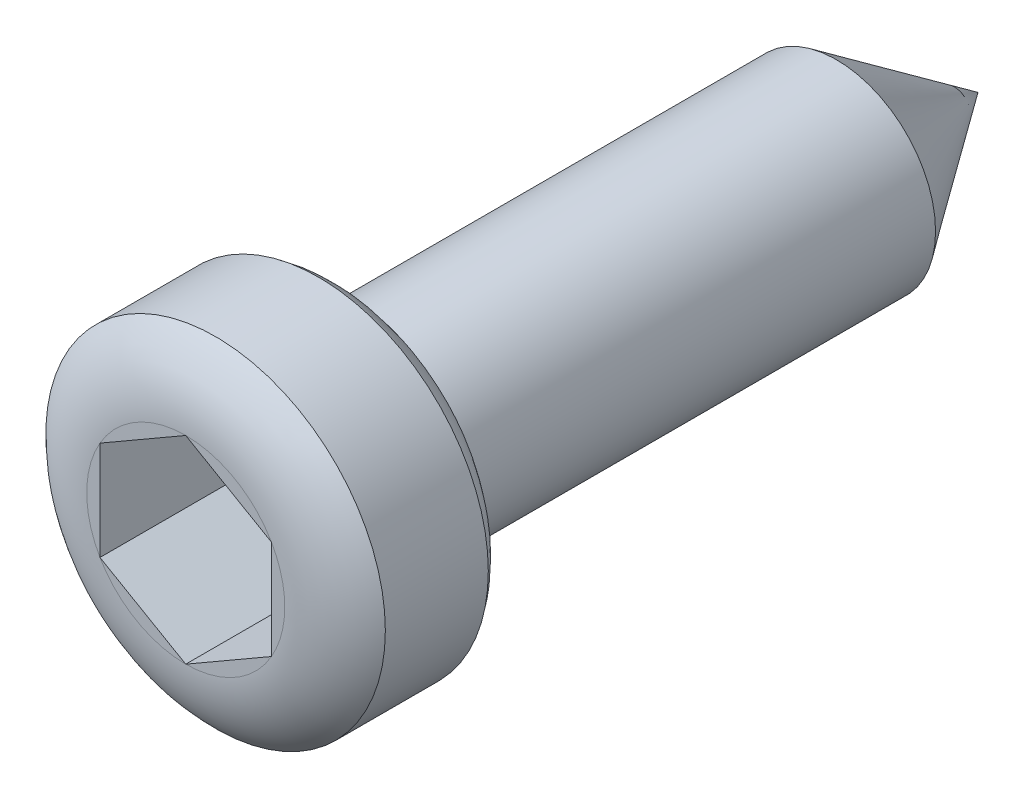
ISO-10303-21;
HEADER;
FILE_DESCRIPTION(('STEP AP214'),'2;1');
FILE_NAME('part.step','',(''),(''),'','','');
FILE_SCHEMA(('AUTOMOTIVE_DESIGN { 1 0 10303 214 1 1 1 1 }'));
ENDSEC;
DATA;
#1=APPLICATION_CONTEXT('core data for automotive mechanical design processes');
#2=APPLICATION_PROTOCOL_DEFINITION('international standard','automotive_design',2000,#1);
#3=PRODUCT_CONTEXT('',#1,'mechanical');
#4=PRODUCT('Part','Part','',(#3));
#5=PRODUCT_RELATED_PRODUCT_CATEGORY('part','',(#4));
#6=PRODUCT_DEFINITION_FORMATION('','',#4);
#7=PRODUCT_DEFINITION_CONTEXT('part definition',#1,'design');
#8=PRODUCT_DEFINITION('design','',#6,#7);
#9=PRODUCT_DEFINITION_SHAPE('','',#8);
#10=(LENGTH_UNIT() NAMED_UNIT(*) SI_UNIT(.MILLI.,.METRE.));
#11=(NAMED_UNIT(*) PLANE_ANGLE_UNIT() SI_UNIT($,.RADIAN.));
#12=(NAMED_UNIT(*) SI_UNIT($,.STERADIAN.) SOLID_ANGLE_UNIT());
#13=UNCERTAINTY_MEASURE_WITH_UNIT(LENGTH_MEASURE(1.E-05),#10,'distance_accuracy_value','');
#14=(GEOMETRIC_REPRESENTATION_CONTEXT(3) GLOBAL_UNCERTAINTY_ASSIGNED_CONTEXT((#13)) GLOBAL_UNIT_ASSIGNED_CONTEXT((#10,
#11,#12)) REPRESENTATION_CONTEXT('',''));
#15=CARTESIAN_POINT('',(0.,0.,0.));
#16=DIRECTION('',(0.,0.,1.));
#17=DIRECTION('',(1.,0.,0.));
#18=AXIS2_PLACEMENT_3D('',#15,#16,#17);
#19=CARTESIAN_POINT('',(0.,0.,0.));
#20=DIRECTION('',(0.,0.,-1.));
#21=DIRECTION('',(-1.,0.,0.));
#22=AXIS2_PLACEMENT_3D('',#19,#20,#21);
#23=PLANE('',#22);
#24=CARTESIAN_POINT('',(0.,0.,0.));
#25=DIRECTION('',(0.,0.,1.));
#26=DIRECTION('',(1.,0.,0.));
#27=AXIS2_PLACEMENT_3D('',#24,#25,#26);
#28=CIRCLE('',#27,1.75);
#29=CARTESIAN_POINT('',(-1.51554445662277,0.875,0.));
#30=VERTEX_POINT('',#29);
#31=CARTESIAN_POINT('',(-1.51554445662277,-0.875000000000001,0.));
#32=VERTEX_POINT('',#31);
#33=EDGE_CURVE('E177',#30,#32,#28,.T.);
#34=ORIENTED_EDGE('',*,*,#33,.T.);
#35=DIRECTION('',(0.,-1.,0.));
#36=VECTOR('',#35,1.);
#37=CARTESIAN_POINT('',(-1.51554445662277,0.,0.));
#38=LINE('',#37,#36);
#39=EDGE_CURVE('E61',#30,#32,#38,.T.);
#40=ORIENTED_EDGE('',*,*,#39,.F.);
#41=EDGE_LOOP('',(#34,#40));
#42=FACE_BOUND('',#41,.T.);
#43=ADVANCED_FACE('F45',(#42),#23,.F.);
#44=CARTESIAN_POINT('',(0.,1.75,0.));
#45=VERTEX_POINT('',#44);
#46=EDGE_CURVE('E53',#45,#30,#28,.T.);
#47=ORIENTED_EDGE('',*,*,#46,.T.);
#48=DIRECTION('',(-0.866025403784439,-0.5,0.));
#49=VECTOR('',#48,1.);
#50=CARTESIAN_POINT('',(-0.757772228311384,1.3125,0.));
#51=LINE('',#50,#49);
#52=EDGE_CURVE('E120',#45,#30,#51,.T.);
#53=ORIENTED_EDGE('',*,*,#52,.F.);
#54=EDGE_LOOP('',(#47,#53));
#55=FACE_BOUND('',#54,.T.);
#56=ADVANCED_FACE('F187',(#55),#23,.F.);
#57=CARTESIAN_POINT('',(1.51554445662277,0.875,0.));
#58=VERTEX_POINT('',#57);
#59=EDGE_CURVE('E13',#58,#45,#28,.T.);
#60=ORIENTED_EDGE('',*,*,#59,.T.);
#61=DIRECTION('',(-0.866025403784439,0.5,0.));
#62=VECTOR('',#61,1.);
#63=CARTESIAN_POINT('',(0.757772228311384,1.3125,0.));
#64=LINE('',#63,#62);
#65=EDGE_CURVE('E123',#58,#45,#64,.T.);
#66=ORIENTED_EDGE('',*,*,#65,.F.);
#67=EDGE_LOOP('',(#60,#66));
#68=FACE_BOUND('',#67,.T.);
#69=ADVANCED_FACE('F192',(#68),#23,.F.);
#70=CARTESIAN_POINT('',(1.51554445662277,-0.875,0.));
#71=VERTEX_POINT('',#70);
#72=EDGE_CURVE('E54',#71,#58,#28,.T.);
#73=ORIENTED_EDGE('',*,*,#72,.T.);
#74=DIRECTION('',(0.,1.,0.));
#75=VECTOR('',#74,1.);
#76=CARTESIAN_POINT('',(1.51554445662277,0.,0.));
#77=LINE('',#76,#75);
#78=EDGE_CURVE('E139',#71,#58,#77,.T.);
#79=ORIENTED_EDGE('',*,*,#78,.F.);
#80=EDGE_LOOP('',(#73,#79));
#81=FACE_BOUND('',#80,.T.);
#82=ADVANCED_FACE('F199',(#81),#23,.F.);
#83=CARTESIAN_POINT('',(0.,-1.75,0.));
#84=VERTEX_POINT('',#83);
#85=EDGE_CURVE('E166',#84,#71,#28,.T.);
#86=ORIENTED_EDGE('',*,*,#85,.T.);
#87=DIRECTION('',(0.866025403784439,0.5,0.));
#88=VECTOR('',#87,1.);
#89=CARTESIAN_POINT('',(0.757772228311384,-1.3125,0.));
#90=LINE('',#89,#88);
#91=EDGE_CURVE('E136',#84,#71,#90,.T.);
#92=ORIENTED_EDGE('',*,*,#91,.F.);
#93=EDGE_LOOP('',(#86,#92));
#94=FACE_BOUND('',#93,.T.);
#95=ADVANCED_FACE('F201',(#94),#23,.F.);
#96=EDGE_CURVE('E172',#32,#84,#28,.T.);
#97=ORIENTED_EDGE('',*,*,#96,.T.);
#98=DIRECTION('',(0.866025403784439,-0.5,0.));
#99=VECTOR('',#98,1.);
#100=CARTESIAN_POINT('',(-0.757772228311384,-1.3125,0.));
#101=LINE('',#100,#99);
#102=EDGE_CURVE('E134',#32,#84,#101,.T.);
#103=ORIENTED_EDGE('',*,*,#102,.F.);
#104=EDGE_LOOP('',(#97,#103));
#105=FACE_BOUND('',#104,.T.);
#106=ADVANCED_FACE('F47',(#105),#23,.F.);
#107=CARTESIAN_POINT('',(0.,0.,-1.74492707895845));
#108=DIRECTION('',(0.,0.,1.));
#109=DIRECTION('',(1.,0.,0.));
#110=AXIS2_PLACEMENT_3D('',#107,#108,#109);
#111=TOROIDAL_SURFACE('',#110,1.75,1.74492707895845);
#112=ORIENTED_EDGE('',*,*,#59,.F.);
#113=ORIENTED_EDGE('',*,*,#72,.F.);
#114=ORIENTED_EDGE('',*,*,#85,.F.);
#115=ORIENTED_EDGE('',*,*,#96,.F.);
#116=ORIENTED_EDGE('',*,*,#33,.F.);
#117=ORIENTED_EDGE('',*,*,#46,.F.);
#118=EDGE_LOOP('',(#112,#113,#114,#115,#116,#117));
#119=FACE_BOUND('',#118,.T.);
#120=CARTESIAN_POINT('',(0.,0.,-0.527441756302582));
#121=DIRECTION('',(0.,0.,1.));
#122=DIRECTION('',(1.,0.,0.));
#123=AXIS2_PLACEMENT_3D('',#120,#121,#122);
#124=CIRCLE('',#123,3.);
#125=CARTESIAN_POINT('',(3.,0.,-0.527441756302582));
#126=VERTEX_POINT('',#125);
#127=EDGE_CURVE('E161',#126,#126,#124,.T.);
#128=ORIENTED_EDGE('',*,*,#127,.T.);
#129=EDGE_LOOP('',(#128));
#130=FACE_BOUND('',#129,.T.);
#131=ADVANCED_FACE('F189',(#119,#130),#111,.T.);
#132=CARTESIAN_POINT('',(0.,0.,0.));
#133=DIRECTION('',(0.,0.,1.));
#134=DIRECTION('',(1.,0.,0.));
#135=AXIS2_PLACEMENT_3D('',#132,#133,#134);
#136=CYLINDRICAL_SURFACE('',#135,3.);
#137=ORIENTED_EDGE('',*,*,#127,.F.);
#138=EDGE_LOOP('',(#137));
#139=FACE_BOUND('',#138,.T.);
#140=CARTESIAN_POINT('',(0.,0.,-2.34684561151548));
#141=DIRECTION('',(0.,0.,1.));
#142=DIRECTION('',(1.,0.,0.));
#143=AXIS2_PLACEMENT_3D('',#140,#141,#142);
#144=CIRCLE('',#143,3.);
#145=CARTESIAN_POINT('',(3.,0.,-2.34684561151548));
#146=VERTEX_POINT('',#145);
#147=EDGE_CURVE('E159',#146,#146,#144,.T.);
#148=ORIENTED_EDGE('',*,*,#147,.T.);
#149=EDGE_LOOP('',(#148));
#150=FACE_BOUND('',#149,.T.);
#151=ADVANCED_FACE('F214',(#139,#150),#136,.T.);
#152=CARTESIAN_POINT('',(0.,0.,-1.51768941392663));
#153=DIRECTION('',(0.,0.,1.));
#154=DIRECTION('',(1.,0.,0.));
#155=AXIS2_PLACEMENT_3D('',#152,#153,#154);
#156=TOROIDAL_SURFACE('',#155,1.75,1.5);
#157=ORIENTED_EDGE('',*,*,#147,.F.);
#158=EDGE_LOOP('',(#157));
#159=FACE_BOUND('',#158,.T.);
#160=CARTESIAN_POINT('',(0.,0.,-3.01768941392663));
#161=DIRECTION('',(0.,0.,1.));
#162=DIRECTION('',(1.,0.,0.));
#163=AXIS2_PLACEMENT_3D('',#160,#161,#162);
#164=CIRCLE('',#163,1.75);
#165=CARTESIAN_POINT('',(1.75,0.,-3.01768941392663));
#166=VERTEX_POINT('',#165);
#167=EDGE_CURVE('E156',#166,#166,#164,.T.);
#168=ORIENTED_EDGE('',*,*,#167,.T.);
#169=EDGE_LOOP('',(#168));
#170=FACE_BOUND('',#169,.T.);
#171=ADVANCED_FACE('F218',(#159,#170),#156,.T.);
#172=CARTESIAN_POINT('',(0.,0.,0.));
#173=DIRECTION('',(0.,0.,1.));
#174=DIRECTION('',(1.,0.,0.));
#175=AXIS2_PLACEMENT_3D('',#172,#173,#174);
#176=CYLINDRICAL_SURFACE('',#175,1.75);
#177=ORIENTED_EDGE('',*,*,#167,.F.);
#178=EDGE_LOOP('',(#177));
#179=FACE_BOUND('',#178,.T.);
#180=CARTESIAN_POINT('',(0.,0.,-11.5));
#181=DIRECTION('',(0.,0.,1.));
#182=DIRECTION('',(1.,0.,0.));
#183=AXIS2_PLACEMENT_3D('',#180,#181,#182);
#184=CIRCLE('',#183,1.75);
#185=CARTESIAN_POINT('',(1.75,0.,-11.5));
#186=VERTEX_POINT('',#185);
#187=EDGE_CURVE('E146',#186,#186,#184,.T.);
#188=ORIENTED_EDGE('',*,*,#187,.T.);
#189=EDGE_LOOP('',(#188));
#190=FACE_BOUND('',#189,.T.);
#191=ADVANCED_FACE('F224',(#179,#190),#176,.T.);
#192=CARTESIAN_POINT('',(0.,0.,-14.));
#193=DIRECTION('',(0.,0.,1.));
#194=DIRECTION('',(1.,0.,0.));
#195=AXIS2_PLACEMENT_3D('',#192,#193,#194);
#196=CONICAL_SURFACE('',#195,0.,0.610725964389209);
#197=ORIENTED_EDGE('',*,*,#187,.F.);
#198=EDGE_LOOP('',(#197));
#199=FACE_BOUND('',#198,.T.);
#200=CARTESIAN_POINT('',(0.,0.,-14.));
#201=VERTEX_POINT('',#200);
#202=VERTEX_LOOP('',#201);
#203=FACE_BOUND('',#202,.T.);
#204=ADVANCED_FACE('F228',(#199,#203),#196,.T.);
#205=CARTESIAN_POINT('',(-1.51554445662277,0.,-2.5));
#206=DIRECTION('',(-1.,0.,0.));
#207=DIRECTION('',(0.,-1.,0.));
#208=AXIS2_PLACEMENT_3D('',#205,#206,#207);
#209=PLANE('',#208);
#210=ORIENTED_EDGE('',*,*,#39,.T.);
#211=DIRECTION('',(0.,0.,1.));
#212=VECTOR('',#211,1.);
#213=CARTESIAN_POINT('',(-1.51554445662277,-0.875,-2.5));
#214=LINE('',#213,#212);
#215=CARTESIAN_POINT('',(-1.51554445662277,-0.875,-2.5));
#216=VERTEX_POINT('',#215);
#217=EDGE_CURVE('E97',#216,#32,#214,.T.);
#218=ORIENTED_EDGE('',*,*,#217,.F.);
#219=DIRECTION('',(0.,-1.,0.));
#220=VECTOR('',#219,1.);
#221=CARTESIAN_POINT('',(-1.51554445662277,0.,-2.5));
#222=LINE('',#221,#220);
#223=CARTESIAN_POINT('',(-1.51554445662277,0.875,-2.5));
#224=VERTEX_POINT('',#223);
#225=EDGE_CURVE('E101',#224,#216,#222,.T.);
#226=ORIENTED_EDGE('',*,*,#225,.F.);
#227=DIRECTION('',(0.,0.,1.));
#228=VECTOR('',#227,1.);
#229=CARTESIAN_POINT('',(-1.51554445662277,0.875,-2.5));
#230=LINE('',#229,#228);
#231=EDGE_CURVE('E144',#224,#30,#230,.T.);
#232=ORIENTED_EDGE('',*,*,#231,.T.);
#233=EDGE_LOOP('',(#210,#218,#226,#232));
#234=FACE_BOUND('',#233,.T.);
#235=ADVANCED_FACE('F99',(#234),#209,.F.);
#236=CARTESIAN_POINT('',(-0.757772228311384,1.3125,-2.5));
#237=DIRECTION('',(-0.5,0.866025403784439,0.));
#238=DIRECTION('',(-0.866025403784439,-0.5,0.));
#239=AXIS2_PLACEMENT_3D('',#236,#237,#238);
#240=PLANE('',#239);
#241=ORIENTED_EDGE('',*,*,#52,.T.);
#242=ORIENTED_EDGE('',*,*,#231,.F.);
#243=DIRECTION('',(-0.866025403784439,-0.5,0.));
#244=VECTOR('',#243,1.);
#245=CARTESIAN_POINT('',(-0.757772228311384,1.3125,-2.5));
#246=LINE('',#245,#244);
#247=CARTESIAN_POINT('',(0.,1.75,-2.5));
#248=VERTEX_POINT('',#247);
#249=EDGE_CURVE('E107',#248,#224,#246,.T.);
#250=ORIENTED_EDGE('',*,*,#249,.F.);
#251=DIRECTION('',(0.,0.,1.));
#252=VECTOR('',#251,1.);
#253=CARTESIAN_POINT('',(0.,1.75,-2.5));
#254=LINE('',#253,#252);
#255=EDGE_CURVE('E147',#248,#45,#254,.T.);
#256=ORIENTED_EDGE('',*,*,#255,.T.);
#257=EDGE_LOOP('',(#241,#242,#250,#256));
#258=FACE_BOUND('',#257,.T.);
#259=ADVANCED_FACE('F235',(#258),#240,.F.);
#260=CARTESIAN_POINT('',(0.757772228311384,1.3125,-2.5));
#261=DIRECTION('',(0.5,0.866025403784439,0.));
#262=DIRECTION('',(-0.866025403784439,0.5,0.));
#263=AXIS2_PLACEMENT_3D('',#260,#261,#262);
#264=PLANE('',#263);
#265=ORIENTED_EDGE('',*,*,#65,.T.);
#266=ORIENTED_EDGE('',*,*,#255,.F.);
#267=DIRECTION('',(-0.866025403784439,0.5,0.));
#268=VECTOR('',#267,1.);
#269=CARTESIAN_POINT('',(0.757772228311384,1.3125,-2.5));
#270=LINE('',#269,#268);
#271=CARTESIAN_POINT('',(1.51554445662277,0.875,-2.5));
#272=VERTEX_POINT('',#271);
#273=EDGE_CURVE('E130',#272,#248,#270,.T.);
#274=ORIENTED_EDGE('',*,*,#273,.F.);
#275=DIRECTION('',(0.,0.,1.));
#276=VECTOR('',#275,1.);
#277=CARTESIAN_POINT('',(1.51554445662277,0.875,-2.5));
#278=LINE('',#277,#276);
#279=EDGE_CURVE('E149',#272,#58,#278,.T.);
#280=ORIENTED_EDGE('',*,*,#279,.T.);
#281=EDGE_LOOP('',(#265,#266,#274,#280));
#282=FACE_BOUND('',#281,.T.);
#283=ADVANCED_FACE('F194',(#282),#264,.F.);
#284=CARTESIAN_POINT('',(1.51554445662277,0.,-2.5));
#285=DIRECTION('',(1.,0.,0.));
#286=DIRECTION('',(0.,1.,0.));
#287=AXIS2_PLACEMENT_3D('',#284,#285,#286);
#288=PLANE('',#287);
#289=ORIENTED_EDGE('',*,*,#78,.T.);
#290=ORIENTED_EDGE('',*,*,#279,.F.);
#291=DIRECTION('',(0.,1.,0.));
#292=VECTOR('',#291,1.);
#293=CARTESIAN_POINT('',(1.51554445662277,0.,-2.5));
#294=LINE('',#293,#292);
#295=CARTESIAN_POINT('',(1.51554445662277,-0.875,-2.5));
#296=VERTEX_POINT('',#295);
#297=EDGE_CURVE('E127',#296,#272,#294,.T.);
#298=ORIENTED_EDGE('',*,*,#297,.F.);
#299=DIRECTION('',(0.,0.,1.));
#300=VECTOR('',#299,1.);
#301=CARTESIAN_POINT('',(1.51554445662277,-0.875,-2.5));
#302=LINE('',#301,#300);
#303=EDGE_CURVE('E151',#296,#71,#302,.T.);
#304=ORIENTED_EDGE('',*,*,#303,.T.);
#305=EDGE_LOOP('',(#289,#290,#298,#304));
#306=FACE_BOUND('',#305,.T.);
#307=ADVANCED_FACE('F198',(#306),#288,.F.);
#308=CARTESIAN_POINT('',(0.757772228311384,-1.3125,-2.5));
#309=DIRECTION('',(0.5,-0.866025403784439,0.));
#310=DIRECTION('',(0.866025403784439,0.5,0.));
#311=AXIS2_PLACEMENT_3D('',#308,#309,#310);
#312=PLANE('',#311);
#313=ORIENTED_EDGE('',*,*,#91,.T.);
#314=ORIENTED_EDGE('',*,*,#303,.F.);
#315=DIRECTION('',(0.866025403784439,0.5,0.));
#316=VECTOR('',#315,1.);
#317=CARTESIAN_POINT('',(0.757772228311384,-1.3125,-2.5));
#318=LINE('',#317,#316);
#319=CARTESIAN_POINT('',(0.,-1.75,-2.5));
#320=VERTEX_POINT('',#319);
#321=EDGE_CURVE('E115',#320,#296,#318,.T.);
#322=ORIENTED_EDGE('',*,*,#321,.F.);
#323=DIRECTION('',(0.,0.,1.));
#324=VECTOR('',#323,1.);
#325=CARTESIAN_POINT('',(0.,-1.75,-2.5));
#326=LINE('',#325,#324);
#327=EDGE_CURVE('E106',#320,#84,#326,.T.);
#328=ORIENTED_EDGE('',*,*,#327,.T.);
#329=EDGE_LOOP('',(#313,#314,#322,#328));
#330=FACE_BOUND('',#329,.T.);
#331=ADVANCED_FACE('F238',(#330),#312,.F.);
#332=CARTESIAN_POINT('',(-0.757772228311384,-1.3125,-2.5));
#333=DIRECTION('',(-0.5,-0.866025403784439,0.));
#334=DIRECTION('',(0.866025403784439,-0.5,0.));
#335=AXIS2_PLACEMENT_3D('',#332,#333,#334);
#336=PLANE('',#335);
#337=ORIENTED_EDGE('',*,*,#102,.T.);
#338=ORIENTED_EDGE('',*,*,#327,.F.);
#339=DIRECTION('',(0.866025403784439,-0.5,0.));
#340=VECTOR('',#339,1.);
#341=CARTESIAN_POINT('',(-0.757772228311384,-1.3125,-2.5));
#342=LINE('',#341,#340);
#343=EDGE_CURVE('E110',#216,#320,#342,.T.);
#344=ORIENTED_EDGE('',*,*,#343,.F.);
#345=ORIENTED_EDGE('',*,*,#217,.T.);
#346=EDGE_LOOP('',(#337,#338,#344,#345));
#347=FACE_BOUND('',#346,.T.);
#348=ADVANCED_FACE('F111',(#347),#336,.F.);
#349=CARTESIAN_POINT('',(0.,0.,-2.5));
#350=DIRECTION('',(0.,0.,1.));
#351=DIRECTION('',(1.,0.,0.));
#352=AXIS2_PLACEMENT_3D('',#349,#350,#351);
#353=PLANE('',#352);
#354=ORIENTED_EDGE('',*,*,#225,.T.);
#355=ORIENTED_EDGE('',*,*,#343,.T.);
#356=ORIENTED_EDGE('',*,*,#321,.T.);
#357=ORIENTED_EDGE('',*,*,#297,.T.);
#358=ORIENTED_EDGE('',*,*,#273,.T.);
#359=ORIENTED_EDGE('',*,*,#249,.T.);
#360=EDGE_LOOP('',(#354,#355,#356,#357,#358,#359));
#361=FACE_BOUND('',#360,.T.);
#362=ADVANCED_FACE('F117',(#361),#353,.T.);
#363=CLOSED_SHELL('',(#43,#56,#69,#82,#95,#106,#131,#151,#171,#191,#204,#235,#259,#283,#307,
#331,#348,#362));
#364=MANIFOLD_SOLID_BREP('B2',#363);
#365=ADVANCED_BREP_SHAPE_REPRESENTATION('',(#18,#364),#14);
#366=SHAPE_DEFINITION_REPRESENTATION(#9,#365);
ENDSEC;
END-ISO-10303-21;
